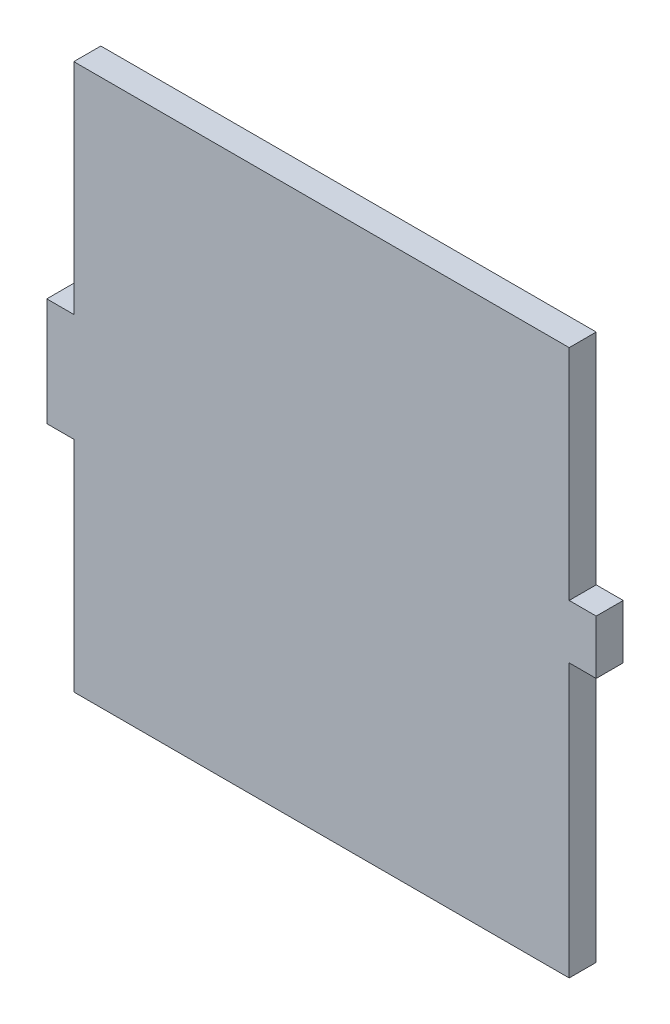
ISO-10303-21;
HEADER;
FILE_DESCRIPTION(('STEP AP214'),'2;1');
FILE_NAME('part.step','',(''),(''),'','','');
FILE_SCHEMA(('AUTOMOTIVE_DESIGN { 1 0 10303 214 1 1 1 1 }'));
ENDSEC;
DATA;
#1=APPLICATION_CONTEXT('core data for automotive mechanical design processes');
#2=APPLICATION_PROTOCOL_DEFINITION('international standard','automotive_design',2000,#1);
#3=PRODUCT_CONTEXT('',#1,'mechanical');
#4=PRODUCT('Part','Part','',(#3));
#5=PRODUCT_RELATED_PRODUCT_CATEGORY('part','',(#4));
#6=PRODUCT_DEFINITION_FORMATION('','',#4);
#7=PRODUCT_DEFINITION_CONTEXT('part definition',#1,'design');
#8=PRODUCT_DEFINITION('design','',#6,#7);
#9=PRODUCT_DEFINITION_SHAPE('','',#8);
#10=(LENGTH_UNIT() NAMED_UNIT(*) SI_UNIT(.MILLI.,.METRE.));
#11=(NAMED_UNIT(*) PLANE_ANGLE_UNIT() SI_UNIT($,.RADIAN.));
#12=(NAMED_UNIT(*) SI_UNIT($,.STERADIAN.) SOLID_ANGLE_UNIT());
#13=UNCERTAINTY_MEASURE_WITH_UNIT(LENGTH_MEASURE(1.E-05),#10,'distance_accuracy_value','');
#14=(GEOMETRIC_REPRESENTATION_CONTEXT(3) GLOBAL_UNCERTAINTY_ASSIGNED_CONTEXT((#13)) GLOBAL_UNIT_ASSIGNED_CONTEXT((#10,
#11,#12)) REPRESENTATION_CONTEXT('',''));
#15=CARTESIAN_POINT('',(0.,0.,0.));
#16=DIRECTION('',(0.,0.,1.));
#17=DIRECTION('',(1.,0.,0.));
#18=AXIS2_PLACEMENT_3D('',#15,#16,#17);
#19=CARTESIAN_POINT('',(0.,0.,3.));
#20=DIRECTION('',(1.,0.,0.));
#21=DIRECTION('',(0.,1.,0.));
#22=AXIS2_PLACEMENT_3D('',#19,#20,#21);
#23=PLANE('',#22);
#24=DIRECTION('',(0.,-1.,0.));
#25=VECTOR('',#24,1.);
#26=CARTESIAN_POINT('',(0.,0.,0.));
#27=LINE('',#26,#25);
#28=CARTESIAN_POINT('',(0.,0.,0.));
#29=VERTEX_POINT('',#28);
#30=CARTESIAN_POINT('',(0.,-24.31,0.));
#31=VERTEX_POINT('',#30);
#32=EDGE_CURVE('E159',#29,#31,#27,.T.);
#33=ORIENTED_EDGE('',*,*,#32,.T.);
#34=DIRECTION('',(0.,0.,-1.));
#35=VECTOR('',#34,1.);
#36=CARTESIAN_POINT('',(0.,-24.31,3.));
#37=LINE('',#36,#35);
#38=CARTESIAN_POINT('',(0.,-24.31,3.));
#39=VERTEX_POINT('',#38);
#40=EDGE_CURVE('E11',#39,#31,#37,.T.);
#41=ORIENTED_EDGE('',*,*,#40,.F.);
#42=DIRECTION('',(0.,-1.,0.));
#43=VECTOR('',#42,1.);
#44=CARTESIAN_POINT('',(0.,0.,3.));
#45=LINE('',#44,#43);
#46=CARTESIAN_POINT('',(0.,0.,3.));
#47=VERTEX_POINT('',#46);
#48=EDGE_CURVE('E181',#47,#39,#45,.T.);
#49=ORIENTED_EDGE('',*,*,#48,.F.);
#50=DIRECTION('',(0.,0.,-1.));
#51=VECTOR('',#50,1.);
#52=CARTESIAN_POINT('',(0.,0.,3.));
#53=LINE('',#52,#51);
#54=EDGE_CURVE('E155',#47,#29,#53,.T.);
#55=ORIENTED_EDGE('',*,*,#54,.T.);
#56=EDGE_LOOP('',(#33,#41,#49,#55));
#57=FACE_BOUND('',#56,.T.);
#58=ADVANCED_FACE('F39',(#57),#23,.F.);
#59=CARTESIAN_POINT('',(0.,-24.31,3.));
#60=DIRECTION('',(0.,-1.,0.));
#61=DIRECTION('',(1.,0.,0.));
#62=AXIS2_PLACEMENT_3D('',#59,#60,#61);
#63=PLANE('',#62);
#64=DIRECTION('',(-1.,0.,0.));
#65=VECTOR('',#64,1.);
#66=CARTESIAN_POINT('',(0.,-24.31,0.));
#67=LINE('',#66,#65);
#68=CARTESIAN_POINT('',(-3.,-24.31,0.));
#69=VERTEX_POINT('',#68);
#70=EDGE_CURVE('E162',#31,#69,#67,.T.);
#71=ORIENTED_EDGE('',*,*,#70,.T.);
#72=DIRECTION('',(0.,0.,-1.));
#73=VECTOR('',#72,1.);
#74=CARTESIAN_POINT('',(-3.,-24.31,3.));
#75=LINE('',#74,#73);
#76=CARTESIAN_POINT('',(-3.,-24.31,3.));
#77=VERTEX_POINT('',#76);
#78=EDGE_CURVE('E47',#77,#69,#75,.T.);
#79=ORIENTED_EDGE('',*,*,#78,.F.);
#80=DIRECTION('',(-1.,0.,0.));
#81=VECTOR('',#80,1.);
#82=CARTESIAN_POINT('',(0.,-24.31,3.));
#83=LINE('',#82,#81);
#84=EDGE_CURVE('E110',#39,#77,#83,.T.);
#85=ORIENTED_EDGE('',*,*,#84,.F.);
#86=ORIENTED_EDGE('',*,*,#40,.T.);
#87=EDGE_LOOP('',(#71,#79,#85,#86));
#88=FACE_BOUND('',#87,.T.);
#89=ADVANCED_FACE('F259',(#88),#63,.F.);
#90=CARTESIAN_POINT('',(-3.,-24.31,3.));
#91=DIRECTION('',(1.,0.,0.));
#92=DIRECTION('',(0.,1.,0.));
#93=AXIS2_PLACEMENT_3D('',#90,#91,#92);
#94=PLANE('',#93);
#95=DIRECTION('',(0.,-1.,0.));
#96=VECTOR('',#95,1.);
#97=CARTESIAN_POINT('',(-3.,-24.31,0.));
#98=LINE('',#97,#96);
#99=CARTESIAN_POINT('',(-3.,-36.31,0.));
#100=VERTEX_POINT('',#99);
#101=EDGE_CURVE('E164',#69,#100,#98,.T.);
#102=ORIENTED_EDGE('',*,*,#101,.T.);
#103=DIRECTION('',(0.,0.,-1.));
#104=VECTOR('',#103,1.);
#105=CARTESIAN_POINT('',(-3.,-36.31,3.));
#106=LINE('',#105,#104);
#107=CARTESIAN_POINT('',(-3.,-36.31,3.));
#108=VERTEX_POINT('',#107);
#109=EDGE_CURVE('E200',#108,#100,#106,.T.);
#110=ORIENTED_EDGE('',*,*,#109,.F.);
#111=DIRECTION('',(0.,-1.,0.));
#112=VECTOR('',#111,1.);
#113=CARTESIAN_POINT('',(-3.,-24.31,3.));
#114=LINE('',#113,#112);
#115=EDGE_CURVE('E208',#77,#108,#114,.T.);
#116=ORIENTED_EDGE('',*,*,#115,.F.);
#117=ORIENTED_EDGE('',*,*,#78,.T.);
#118=EDGE_LOOP('',(#102,#110,#116,#117));
#119=FACE_BOUND('',#118,.T.);
#120=ADVANCED_FACE('F206',(#119),#94,.F.);
#121=CARTESIAN_POINT('',(0.,-36.31,3.));
#122=DIRECTION('',(0.,1.,0.));
#123=DIRECTION('',(0.,0.,1.));
#124=AXIS2_PLACEMENT_3D('',#121,#122,#123);
#125=PLANE('',#124);
#126=DIRECTION('',(1.,0.,0.));
#127=VECTOR('',#126,1.);
#128=CARTESIAN_POINT('',(0.,-36.31,0.));
#129=LINE('',#128,#127);
#130=CARTESIAN_POINT('',(0.,-36.31,0.));
#131=VERTEX_POINT('',#130);
#132=EDGE_CURVE('E166',#100,#131,#129,.T.);
#133=ORIENTED_EDGE('',*,*,#132,.T.);
#134=DIRECTION('',(0.,0.,-1.));
#135=VECTOR('',#134,1.);
#136=CARTESIAN_POINT('',(0.,-36.31,3.));
#137=LINE('',#136,#135);
#138=CARTESIAN_POINT('',(0.,-36.31,3.));
#139=VERTEX_POINT('',#138);
#140=EDGE_CURVE('E197',#139,#131,#137,.T.);
#141=ORIENTED_EDGE('',*,*,#140,.F.);
#142=DIRECTION('',(1.,0.,0.));
#143=VECTOR('',#142,1.);
#144=CARTESIAN_POINT('',(0.,-36.31,3.));
#145=LINE('',#144,#143);
#146=EDGE_CURVE('E226',#108,#139,#145,.T.);
#147=ORIENTED_EDGE('',*,*,#146,.F.);
#148=ORIENTED_EDGE('',*,*,#109,.T.);
#149=EDGE_LOOP('',(#133,#141,#147,#148));
#150=FACE_BOUND('',#149,.T.);
#151=ADVANCED_FACE('F217',(#150),#125,.F.);
#152=CARTESIAN_POINT('',(0.,-36.31,3.));
#153=DIRECTION('',(1.,0.,0.));
#154=DIRECTION('',(0.,1.,0.));
#155=AXIS2_PLACEMENT_3D('',#152,#153,#154);
#156=PLANE('',#155);
#157=DIRECTION('',(0.,-1.,0.));
#158=VECTOR('',#157,1.);
#159=CARTESIAN_POINT('',(0.,-36.31,0.));
#160=LINE('',#159,#158);
#161=CARTESIAN_POINT('',(0.,-60.61,0.));
#162=VERTEX_POINT('',#161);
#163=EDGE_CURVE('E168',#131,#162,#160,.T.);
#164=ORIENTED_EDGE('',*,*,#163,.T.);
#165=DIRECTION('',(0.,0.,-1.));
#166=VECTOR('',#165,1.);
#167=CARTESIAN_POINT('',(0.,-60.61,3.));
#168=LINE('',#167,#166);
#169=CARTESIAN_POINT('',(0.,-60.61,3.));
#170=VERTEX_POINT('',#169);
#171=EDGE_CURVE('E194',#170,#162,#168,.T.);
#172=ORIENTED_EDGE('',*,*,#171,.F.);
#173=DIRECTION('',(0.,-1.,0.));
#174=VECTOR('',#173,1.);
#175=CARTESIAN_POINT('',(0.,-36.31,3.));
#176=LINE('',#175,#174);
#177=EDGE_CURVE('E223',#139,#170,#176,.T.);
#178=ORIENTED_EDGE('',*,*,#177,.F.);
#179=ORIENTED_EDGE('',*,*,#140,.T.);
#180=EDGE_LOOP('',(#164,#172,#178,#179));
#181=FACE_BOUND('',#180,.T.);
#182=ADVANCED_FACE('F221',(#181),#156,.F.);
#183=CARTESIAN_POINT('',(0.,-60.61,3.));
#184=DIRECTION('',(0.,1.,0.));
#185=DIRECTION('',(0.,0.,1.));
#186=AXIS2_PLACEMENT_3D('',#183,#184,#185);
#187=PLANE('',#186);
#188=DIRECTION('',(1.,0.,0.));
#189=VECTOR('',#188,1.);
#190=CARTESIAN_POINT('',(0.,-60.61,0.));
#191=LINE('',#190,#189);
#192=CARTESIAN_POINT('',(55.,-60.61,0.));
#193=VERTEX_POINT('',#192);
#194=EDGE_CURVE('E170',#162,#193,#191,.T.);
#195=ORIENTED_EDGE('',*,*,#194,.T.);
#196=DIRECTION('',(0.,0.,-1.));
#197=VECTOR('',#196,1.);
#198=CARTESIAN_POINT('',(55.,-60.61,3.));
#199=LINE('',#198,#197);
#200=CARTESIAN_POINT('',(55.,-60.61,3.));
#201=VERTEX_POINT('',#200);
#202=EDGE_CURVE('E191',#201,#193,#199,.T.);
#203=ORIENTED_EDGE('',*,*,#202,.F.);
#204=DIRECTION('',(1.,0.,0.));
#205=VECTOR('',#204,1.);
#206=CARTESIAN_POINT('',(0.,-60.61,3.));
#207=LINE('',#206,#205);
#208=EDGE_CURVE('E225',#170,#201,#207,.T.);
#209=ORIENTED_EDGE('',*,*,#208,.F.);
#210=ORIENTED_EDGE('',*,*,#171,.T.);
#211=EDGE_LOOP('',(#195,#203,#209,#210));
#212=FACE_BOUND('',#211,.T.);
#213=ADVANCED_FACE('F272',(#212),#187,.F.);
#214=CARTESIAN_POINT('',(55.,-30.31,3.));
#215=DIRECTION('',(-1.,0.,0.));
#216=DIRECTION('',(0.,-1.,0.));
#217=AXIS2_PLACEMENT_3D('',#214,#215,#216);
#218=PLANE('',#217);
#219=DIRECTION('',(0.,1.,0.));
#220=VECTOR('',#219,1.);
#221=CARTESIAN_POINT('',(55.,-30.31,0.));
#222=LINE('',#221,#220);
#223=CARTESIAN_POINT('',(55.,-30.31,0.));
#224=VERTEX_POINT('',#223);
#225=EDGE_CURVE('E172',#193,#224,#222,.T.);
#226=ORIENTED_EDGE('',*,*,#225,.T.);
#227=DIRECTION('',(0.,0.,-1.));
#228=VECTOR('',#227,1.);
#229=CARTESIAN_POINT('',(55.,-30.31,3.));
#230=LINE('',#229,#228);
#231=CARTESIAN_POINT('',(55.,-30.31,3.));
#232=VERTEX_POINT('',#231);
#233=EDGE_CURVE('E188',#232,#224,#230,.T.);
#234=ORIENTED_EDGE('',*,*,#233,.F.);
#235=DIRECTION('',(0.,1.,0.));
#236=VECTOR('',#235,1.);
#237=CARTESIAN_POINT('',(55.,-30.31,3.));
#238=LINE('',#237,#236);
#239=EDGE_CURVE('E228',#201,#232,#238,.T.);
#240=ORIENTED_EDGE('',*,*,#239,.F.);
#241=ORIENTED_EDGE('',*,*,#202,.T.);
#242=EDGE_LOOP('',(#226,#234,#240,#241));
#243=FACE_BOUND('',#242,.T.);
#244=ADVANCED_FACE('F275',(#243),#218,.F.);
#245=CARTESIAN_POINT('',(55.,-30.31,3.));
#246=DIRECTION('',(0.,1.,0.));
#247=DIRECTION('',(0.,0.,1.));
#248=AXIS2_PLACEMENT_3D('',#245,#246,#247);
#249=PLANE('',#248);
#250=DIRECTION('',(1.,0.,0.));
#251=VECTOR('',#250,1.);
#252=CARTESIAN_POINT('',(55.,-30.31,0.));
#253=LINE('',#252,#251);
#254=CARTESIAN_POINT('',(58.,-30.31,0.));
#255=VERTEX_POINT('',#254);
#256=EDGE_CURVE('E174',#224,#255,#253,.T.);
#257=ORIENTED_EDGE('',*,*,#256,.T.);
#258=DIRECTION('',(0.,0.,-1.));
#259=VECTOR('',#258,1.);
#260=CARTESIAN_POINT('',(58.,-30.31,3.));
#261=LINE('',#260,#259);
#262=CARTESIAN_POINT('',(58.,-30.31,3.));
#263=VERTEX_POINT('',#262);
#264=EDGE_CURVE('E185',#263,#255,#261,.T.);
#265=ORIENTED_EDGE('',*,*,#264,.F.);
#266=DIRECTION('',(1.,0.,0.));
#267=VECTOR('',#266,1.);
#268=CARTESIAN_POINT('',(55.,-30.31,3.));
#269=LINE('',#268,#267);
#270=EDGE_CURVE('E234',#232,#263,#269,.T.);
#271=ORIENTED_EDGE('',*,*,#270,.F.);
#272=ORIENTED_EDGE('',*,*,#233,.T.);
#273=EDGE_LOOP('',(#257,#265,#271,#272));
#274=FACE_BOUND('',#273,.T.);
#275=ADVANCED_FACE('F240',(#274),#249,.F.);
#276=CARTESIAN_POINT('',(58.,-24.31,3.));
#277=DIRECTION('',(-1.,0.,0.));
#278=DIRECTION('',(0.,-1.,0.));
#279=AXIS2_PLACEMENT_3D('',#276,#277,#278);
#280=PLANE('',#279);
#281=DIRECTION('',(0.,1.,0.));
#282=VECTOR('',#281,1.);
#283=CARTESIAN_POINT('',(58.,-24.31,0.));
#284=LINE('',#283,#282);
#285=CARTESIAN_POINT('',(58.,-24.31,0.));
#286=VERTEX_POINT('',#285);
#287=EDGE_CURVE('E176',#255,#286,#284,.T.);
#288=ORIENTED_EDGE('',*,*,#287,.T.);
#289=DIRECTION('',(0.,0.,-1.));
#290=VECTOR('',#289,1.);
#291=CARTESIAN_POINT('',(58.,-24.31,3.));
#292=LINE('',#291,#290);
#293=CARTESIAN_POINT('',(58.,-24.31,3.));
#294=VERTEX_POINT('',#293);
#295=EDGE_CURVE('E150',#294,#286,#292,.T.);
#296=ORIENTED_EDGE('',*,*,#295,.F.);
#297=DIRECTION('',(0.,1.,0.));
#298=VECTOR('',#297,1.);
#299=CARTESIAN_POINT('',(58.,-24.31,3.));
#300=LINE('',#299,#298);
#301=EDGE_CURVE('E141',#263,#294,#300,.T.);
#302=ORIENTED_EDGE('',*,*,#301,.F.);
#303=ORIENTED_EDGE('',*,*,#264,.T.);
#304=EDGE_LOOP('',(#288,#296,#302,#303));
#305=FACE_BOUND('',#304,.T.);
#306=ADVANCED_FACE('F244',(#305),#280,.F.);
#307=CARTESIAN_POINT('',(55.,-24.31,3.));
#308=DIRECTION('',(0.,-1.,0.));
#309=DIRECTION('',(0.,0.,-1.));
#310=AXIS2_PLACEMENT_3D('',#307,#308,#309);
#311=PLANE('',#310);
#312=DIRECTION('',(-1.,0.,0.));
#313=VECTOR('',#312,1.);
#314=CARTESIAN_POINT('',(55.,-24.31,0.));
#315=LINE('',#314,#313);
#316=CARTESIAN_POINT('',(55.,-24.31,0.));
#317=VERTEX_POINT('',#316);
#318=EDGE_CURVE('E149',#286,#317,#315,.T.);
#319=ORIENTED_EDGE('',*,*,#318,.T.);
#320=DIRECTION('',(0.,0.,-1.));
#321=VECTOR('',#320,1.);
#322=CARTESIAN_POINT('',(55.,-24.31,3.));
#323=LINE('',#322,#321);
#324=CARTESIAN_POINT('',(55.,-24.31,3.));
#325=VERTEX_POINT('',#324);
#326=EDGE_CURVE('E146',#325,#317,#323,.T.);
#327=ORIENTED_EDGE('',*,*,#326,.F.);
#328=DIRECTION('',(-1.,0.,0.));
#329=VECTOR('',#328,1.);
#330=CARTESIAN_POINT('',(55.,-24.31,3.));
#331=LINE('',#330,#329);
#332=EDGE_CURVE('E135',#294,#325,#331,.T.);
#333=ORIENTED_EDGE('',*,*,#332,.F.);
#334=ORIENTED_EDGE('',*,*,#295,.T.);
#335=EDGE_LOOP('',(#319,#327,#333,#334));
#336=FACE_BOUND('',#335,.T.);
#337=ADVANCED_FACE('F147',(#336),#311,.F.);
#338=CARTESIAN_POINT('',(55.,0.,3.));
#339=DIRECTION('',(-1.,0.,0.));
#340=DIRECTION('',(0.,-1.,0.));
#341=AXIS2_PLACEMENT_3D('',#338,#339,#340);
#342=PLANE('',#341);
#343=DIRECTION('',(0.,1.,0.));
#344=VECTOR('',#343,1.);
#345=CARTESIAN_POINT('',(55.,0.,0.));
#346=LINE('',#345,#344);
#347=CARTESIAN_POINT('',(55.,0.,0.));
#348=VERTEX_POINT('',#347);
#349=EDGE_CURVE('E96',#317,#348,#346,.T.);
#350=ORIENTED_EDGE('',*,*,#349,.T.);
#351=DIRECTION('',(0.,0.,-1.));
#352=VECTOR('',#351,1.);
#353=CARTESIAN_POINT('',(55.,0.,3.));
#354=LINE('',#353,#352);
#355=CARTESIAN_POINT('',(55.,0.,3.));
#356=VERTEX_POINT('',#355);
#357=EDGE_CURVE('E151',#356,#348,#354,.T.);
#358=ORIENTED_EDGE('',*,*,#357,.F.);
#359=DIRECTION('',(0.,1.,0.));
#360=VECTOR('',#359,1.);
#361=CARTESIAN_POINT('',(55.,0.,3.));
#362=LINE('',#361,#360);
#363=EDGE_CURVE('E139',#325,#356,#362,.T.);
#364=ORIENTED_EDGE('',*,*,#363,.F.);
#365=ORIENTED_EDGE('',*,*,#326,.T.);
#366=EDGE_LOOP('',(#350,#358,#364,#365));
#367=FACE_BOUND('',#366,.T.);
#368=ADVANCED_FACE('F153',(#367),#342,.F.);
#369=CARTESIAN_POINT('',(0.,0.,3.));
#370=DIRECTION('',(0.,-1.,0.));
#371=DIRECTION('',(0.,0.,-1.));
#372=AXIS2_PLACEMENT_3D('',#369,#370,#371);
#373=PLANE('',#372);
#374=DIRECTION('',(-1.,0.,0.));
#375=VECTOR('',#374,1.);
#376=CARTESIAN_POINT('',(0.,0.,0.));
#377=LINE('',#376,#375);
#378=EDGE_CURVE('E102',#348,#29,#377,.T.);
#379=ORIENTED_EDGE('',*,*,#378,.T.);
#380=ORIENTED_EDGE('',*,*,#54,.F.);
#381=DIRECTION('',(-1.,0.,0.));
#382=VECTOR('',#381,1.);
#383=CARTESIAN_POINT('',(0.,0.,3.));
#384=LINE('',#383,#382);
#385=EDGE_CURVE('E55',#356,#47,#384,.T.);
#386=ORIENTED_EDGE('',*,*,#385,.F.);
#387=ORIENTED_EDGE('',*,*,#357,.T.);
#388=EDGE_LOOP('',(#379,#380,#386,#387));
#389=FACE_BOUND('',#388,.T.);
#390=ADVANCED_FACE('F248',(#389),#373,.F.);
#391=CARTESIAN_POINT('',(0.,0.,3.));
#392=DIRECTION('',(0.,0.,-1.));
#393=DIRECTION('',(-1.,0.,0.));
#394=AXIS2_PLACEMENT_3D('',#391,#392,#393);
#395=PLANE('',#394);
#396=ORIENTED_EDGE('',*,*,#48,.T.);
#397=ORIENTED_EDGE('',*,*,#84,.T.);
#398=ORIENTED_EDGE('',*,*,#115,.T.);
#399=ORIENTED_EDGE('',*,*,#146,.T.);
#400=ORIENTED_EDGE('',*,*,#177,.T.);
#401=ORIENTED_EDGE('',*,*,#208,.T.);
#402=ORIENTED_EDGE('',*,*,#239,.T.);
#403=ORIENTED_EDGE('',*,*,#270,.T.);
#404=ORIENTED_EDGE('',*,*,#301,.T.);
#405=ORIENTED_EDGE('',*,*,#332,.T.);
#406=ORIENTED_EDGE('',*,*,#363,.T.);
#407=ORIENTED_EDGE('',*,*,#385,.T.);
#408=EDGE_LOOP('',(#396,#397,#398,#399,#400,#401,#402,#403,#404,#405,#406,#407));
#409=FACE_BOUND('',#408,.T.);
#410=ADVANCED_FACE('F137',(#409),#395,.F.);
#411=CARTESIAN_POINT('',(0.,0.,0.));
#412=DIRECTION('',(0.,0.,-1.));
#413=DIRECTION('',(-1.,0.,0.));
#414=AXIS2_PLACEMENT_3D('',#411,#412,#413);
#415=PLANE('',#414);
#416=ORIENTED_EDGE('',*,*,#32,.F.);
#417=ORIENTED_EDGE('',*,*,#378,.F.);
#418=ORIENTED_EDGE('',*,*,#349,.F.);
#419=ORIENTED_EDGE('',*,*,#318,.F.);
#420=ORIENTED_EDGE('',*,*,#287,.F.);
#421=ORIENTED_EDGE('',*,*,#256,.F.);
#422=ORIENTED_EDGE('',*,*,#225,.F.);
#423=ORIENTED_EDGE('',*,*,#194,.F.);
#424=ORIENTED_EDGE('',*,*,#163,.F.);
#425=ORIENTED_EDGE('',*,*,#132,.F.);
#426=ORIENTED_EDGE('',*,*,#101,.F.);
#427=ORIENTED_EDGE('',*,*,#70,.F.);
#428=EDGE_LOOP('',(#416,#417,#418,#419,#420,#421,#422,#423,#424,#425,#426,#427));
#429=FACE_BOUND('',#428,.T.);
#430=ADVANCED_FACE('F212',(#429),#415,.T.);
#431=CLOSED_SHELL('',(#58,#89,#120,#151,#182,#213,#244,#275,#306,#337,#368,#390,#410,#430));
#432=MANIFOLD_SOLID_BREP('B2',#431);
#433=ADVANCED_BREP_SHAPE_REPRESENTATION('',(#18,#432),#14);
#434=SHAPE_DEFINITION_REPRESENTATION(#9,#433);
ENDSEC;
END-ISO-10303-21;
